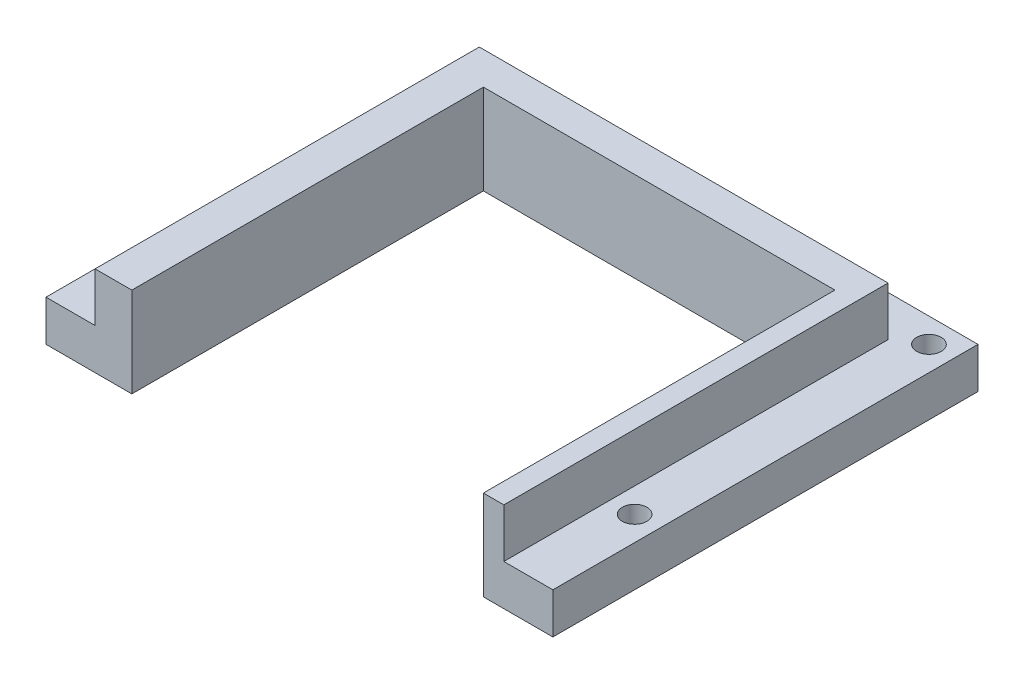
ISO-10303-21;
HEADER;
FILE_DESCRIPTION(('STEP AP214'),'2;1');
FILE_NAME('part.step','',(''),(''),'','','');
FILE_SCHEMA(('AUTOMOTIVE_DESIGN { 1 0 10303 214 1 1 1 1 }'));
ENDSEC;
DATA;
#1=APPLICATION_CONTEXT('core data for automotive mechanical design processes');
#2=APPLICATION_PROTOCOL_DEFINITION('international standard','automotive_design',2000,#1);
#3=PRODUCT_CONTEXT('',#1,'mechanical');
#4=PRODUCT('Part','Part','',(#3));
#5=PRODUCT_RELATED_PRODUCT_CATEGORY('part','',(#4));
#6=PRODUCT_DEFINITION_FORMATION('','',#4);
#7=PRODUCT_DEFINITION_CONTEXT('part definition',#1,'design');
#8=PRODUCT_DEFINITION('design','',#6,#7);
#9=PRODUCT_DEFINITION_SHAPE('','',#8);
#10=(LENGTH_UNIT() NAMED_UNIT(*) SI_UNIT(.MILLI.,.METRE.));
#11=(NAMED_UNIT(*) PLANE_ANGLE_UNIT() SI_UNIT($,.RADIAN.));
#12=(NAMED_UNIT(*) SI_UNIT($,.STERADIAN.) SOLID_ANGLE_UNIT());
#13=UNCERTAINTY_MEASURE_WITH_UNIT(LENGTH_MEASURE(1.E-05),#10,'distance_accuracy_value','');
#14=(GEOMETRIC_REPRESENTATION_CONTEXT(3) GLOBAL_UNCERTAINTY_ASSIGNED_CONTEXT((#13)) GLOBAL_UNIT_ASSIGNED_CONTEXT((#10,
#11,#12)) REPRESENTATION_CONTEXT('',''));
#15=CARTESIAN_POINT('',(0.,0.,0.));
#16=DIRECTION('',(0.,0.,1.));
#17=DIRECTION('',(1.,0.,0.));
#18=AXIS2_PLACEMENT_3D('',#15,#16,#17);
#19=CARTESIAN_POINT('',(0.,5.,0.));
#20=DIRECTION('',(0.,0.,-1.));
#21=DIRECTION('',(-1.,0.,0.));
#22=AXIS2_PLACEMENT_3D('',#19,#20,#21);
#23=PLANE('',#22);
#24=DIRECTION('',(0.,-1.,0.));
#25=VECTOR('',#24,1.);
#26=CARTESIAN_POINT('',(53.5,20.,0.));
#27=LINE('',#26,#25);
#28=CARTESIAN_POINT('',(53.5,11.,0.));
#29=VERTEX_POINT('',#28);
#30=CARTESIAN_POINT('',(53.5,0.,0.));
#31=VERTEX_POINT('',#30);
#32=EDGE_CURVE('E253',#29,#31,#27,.T.);
#33=ORIENTED_EDGE('',*,*,#32,.T.);
#34=DIRECTION('',(1.,0.,0.));
#35=VECTOR('',#34,1.);
#36=CARTESIAN_POINT('',(0.,0.,0.));
#37=LINE('',#36,#35);
#38=CARTESIAN_POINT('',(62.,0.,0.));
#39=VERTEX_POINT('',#38);
#40=EDGE_CURVE('E178',#31,#39,#37,.T.);
#41=ORIENTED_EDGE('',*,*,#40,.T.);
#42=DIRECTION('',(0.,-1.,0.));
#43=VECTOR('',#42,1.);
#44=CARTESIAN_POINT('',(62.,5.,0.));
#45=LINE('',#44,#43);
#46=CARTESIAN_POINT('',(62.,5.,0.));
#47=VERTEX_POINT('',#46);
#48=EDGE_CURVE('E192',#47,#39,#45,.T.);
#49=ORIENTED_EDGE('',*,*,#48,.F.);
#50=DIRECTION('',(1.,0.,0.));
#51=VECTOR('',#50,1.);
#52=CARTESIAN_POINT('',(0.,5.,0.));
#53=LINE('',#52,#51);
#54=CARTESIAN_POINT('',(56.,5.,0.));
#55=VERTEX_POINT('',#54);
#56=EDGE_CURVE('E90',#55,#47,#53,.T.);
#57=ORIENTED_EDGE('',*,*,#56,.F.);
#58=DIRECTION('',(0.,-1.,0.));
#59=VECTOR('',#58,1.);
#60=CARTESIAN_POINT('',(56.,11.,0.));
#61=LINE('',#60,#59);
#62=CARTESIAN_POINT('',(56.,11.,0.));
#63=VERTEX_POINT('',#62);
#64=EDGE_CURVE('E139',#63,#55,#61,.T.);
#65=ORIENTED_EDGE('',*,*,#64,.F.);
#66=DIRECTION('',(1.,0.,0.));
#67=VECTOR('',#66,1.);
#68=CARTESIAN_POINT('',(0.,11.,0.));
#69=LINE('',#68,#67);
#70=EDGE_CURVE('E221',#29,#63,#69,.T.);
#71=ORIENTED_EDGE('',*,*,#70,.F.);
#72=EDGE_LOOP('',(#33,#41,#49,#57,#65,#71));
#73=FACE_BOUND('',#72,.T.);
#74=ADVANCED_FACE('F35',(#73),#23,.F.);
#75=DIRECTION('',(0.,-1.,0.));
#76=VECTOR('',#75,1.);
#77=CARTESIAN_POINT('',(10.5,20.,0.));
#78=LINE('',#77,#76);
#79=CARTESIAN_POINT('',(10.5,11.,0.));
#80=VERTEX_POINT('',#79);
#81=CARTESIAN_POINT('',(10.5,0.,0.));
#82=VERTEX_POINT('',#81);
#83=EDGE_CURVE('E224',#80,#82,#78,.T.);
#84=ORIENTED_EDGE('',*,*,#83,.F.);
#85=CARTESIAN_POINT('',(6.,11.,0.));
#86=VERTEX_POINT('',#85);
#87=EDGE_CURVE('E127',#86,#80,#69,.T.);
#88=ORIENTED_EDGE('',*,*,#87,.F.);
#89=DIRECTION('',(0.,-1.,0.));
#90=VECTOR('',#89,1.);
#91=CARTESIAN_POINT('',(6.,11.,0.));
#92=LINE('',#91,#90);
#93=CARTESIAN_POINT('',(6.,5.,0.));
#94=VERTEX_POINT('',#93);
#95=EDGE_CURVE('E119',#86,#94,#92,.T.);
#96=ORIENTED_EDGE('',*,*,#95,.T.);
#97=CARTESIAN_POINT('',(0.,5.,0.));
#98=VERTEX_POINT('',#97);
#99=EDGE_CURVE('E105',#98,#94,#53,.T.);
#100=ORIENTED_EDGE('',*,*,#99,.F.);
#101=DIRECTION('',(0.,-1.,0.));
#102=VECTOR('',#101,1.);
#103=CARTESIAN_POINT('',(0.,5.,0.));
#104=LINE('',#103,#102);
#105=CARTESIAN_POINT('',(0.,0.,0.));
#106=VERTEX_POINT('',#105);
#107=EDGE_CURVE('E81',#98,#106,#104,.T.);
#108=ORIENTED_EDGE('',*,*,#107,.T.);
#109=EDGE_CURVE('E147',#106,#82,#37,.T.);
#110=ORIENTED_EDGE('',*,*,#109,.T.);
#111=EDGE_LOOP('',(#84,#88,#96,#100,#108,#110));
#112=FACE_BOUND('',#111,.T.);
#113=ADVANCED_FACE('F125',(#112),#23,.F.);
#114=CARTESIAN_POINT('',(0.,0.,0.));
#115=DIRECTION('',(0.,1.,0.));
#116=DIRECTION('',(0.,0.,1.));
#117=AXIS2_PLACEMENT_3D('',#114,#115,#116);
#118=PLANE('',#117);
#119=CARTESIAN_POINT('',(3.,0.,-49.));
#120=DIRECTION('',(0.,1.,0.));
#121=DIRECTION('',(0.,0.,1.));
#122=AXIS2_PLACEMENT_3D('',#119,#120,#121);
#123=CIRCLE('',#122,1.5);
#124=CARTESIAN_POINT('',(3.,0.,-47.5));
#125=VERTEX_POINT('',#124);
#126=EDGE_CURVE('E173',#125,#125,#123,.T.);
#127=ORIENTED_EDGE('',*,*,#126,.T.);
#128=EDGE_LOOP('',(#127));
#129=FACE_BOUND('',#128,.T.);
#130=CARTESIAN_POINT('',(59.,0.,-49.));
#131=DIRECTION('',(0.,1.,0.));
#132=DIRECTION('',(0.,0.,1.));
#133=AXIS2_PLACEMENT_3D('',#130,#131,#132);
#134=CIRCLE('',#133,1.5);
#135=CARTESIAN_POINT('',(59.,0.,-47.5));
#136=VERTEX_POINT('',#135);
#137=EDGE_CURVE('E170',#136,#136,#134,.T.);
#138=ORIENTED_EDGE('',*,*,#137,.T.);
#139=EDGE_LOOP('',(#138));
#140=FACE_BOUND('',#139,.T.);
#141=CARTESIAN_POINT('',(59.,0.,-13.));
#142=DIRECTION('',(0.,1.,0.));
#143=DIRECTION('',(0.,0.,1.));
#144=AXIS2_PLACEMENT_3D('',#141,#142,#143);
#145=CIRCLE('',#144,1.5);
#146=CARTESIAN_POINT('',(59.,0.,-11.5));
#147=VERTEX_POINT('',#146);
#148=EDGE_CURVE('E167',#147,#147,#145,.T.);
#149=ORIENTED_EDGE('',*,*,#148,.T.);
#150=EDGE_LOOP('',(#149));
#151=FACE_BOUND('',#150,.T.);
#152=CARTESIAN_POINT('',(3.,0.,-13.));
#153=DIRECTION('',(0.,1.,0.));
#154=DIRECTION('',(0.,0.,1.));
#155=AXIS2_PLACEMENT_3D('',#152,#153,#154);
#156=CIRCLE('',#155,1.5);
#157=CARTESIAN_POINT('',(3.,0.,-11.5));
#158=VERTEX_POINT('',#157);
#159=EDGE_CURVE('E142',#158,#158,#156,.T.);
#160=ORIENTED_EDGE('',*,*,#159,.T.);
#161=EDGE_LOOP('',(#160));
#162=FACE_BOUND('',#161,.T.);
#163=DIRECTION('',(0.,0.,-1.));
#164=VECTOR('',#163,1.);
#165=CARTESIAN_POINT('',(53.5,0.,0.));
#166=LINE('',#165,#164);
#167=CARTESIAN_POINT('',(53.5,0.,-43.));
#168=VERTEX_POINT('',#167);
#169=EDGE_CURVE('E260',#31,#168,#166,.T.);
#170=ORIENTED_EDGE('',*,*,#169,.T.);
#171=DIRECTION('',(-1.,0.,0.));
#172=VECTOR('',#171,1.);
#173=CARTESIAN_POINT('',(53.5,0.,-43.));
#174=LINE('',#173,#172);
#175=CARTESIAN_POINT('',(10.5,0.,-43.));
#176=VERTEX_POINT('',#175);
#177=EDGE_CURVE('E217',#168,#176,#174,.T.);
#178=ORIENTED_EDGE('',*,*,#177,.T.);
#179=DIRECTION('',(0.,0.,1.));
#180=VECTOR('',#179,1.);
#181=CARTESIAN_POINT('',(10.5,0.,0.));
#182=LINE('',#181,#180);
#183=EDGE_CURVE('E252',#176,#82,#182,.T.);
#184=ORIENTED_EDGE('',*,*,#183,.T.);
#185=ORIENTED_EDGE('',*,*,#109,.F.);
#186=DIRECTION('',(0.,0.,-1.));
#187=VECTOR('',#186,1.);
#188=CARTESIAN_POINT('',(0.,0.,0.));
#189=LINE('',#188,#187);
#190=CARTESIAN_POINT('',(0.,0.,-52.));
#191=VERTEX_POINT('',#190);
#192=EDGE_CURVE('E184',#106,#191,#189,.T.);
#193=ORIENTED_EDGE('',*,*,#192,.T.);
#194=DIRECTION('',(1.,0.,0.));
#195=VECTOR('',#194,1.);
#196=CARTESIAN_POINT('',(0.,0.,-52.));
#197=LINE('',#196,#195);
#198=CARTESIAN_POINT('',(62.,0.,-52.));
#199=VERTEX_POINT('',#198);
#200=EDGE_CURVE('E181',#191,#199,#197,.T.);
#201=ORIENTED_EDGE('',*,*,#200,.T.);
#202=DIRECTION('',(0.,0.,-1.));
#203=VECTOR('',#202,1.);
#204=CARTESIAN_POINT('',(62.,0.,0.));
#205=LINE('',#204,#203);
#206=EDGE_CURVE('E176',#39,#199,#205,.T.);
#207=ORIENTED_EDGE('',*,*,#206,.F.);
#208=ORIENTED_EDGE('',*,*,#40,.F.);
#209=EDGE_LOOP('',(#170,#178,#184,#185,#193,#201,#207,#208));
#210=FACE_BOUND('',#209,.T.);
#211=ADVANCED_FACE('F255',(#129,#140,#151,#162,#210),#118,.F.);
#212=CARTESIAN_POINT('',(0.,11.,0.));
#213=DIRECTION('',(0.,1.,0.));
#214=DIRECTION('',(0.,0.,1.));
#215=AXIS2_PLACEMENT_3D('',#212,#213,#214);
#216=PLANE('',#215);
#217=DIRECTION('',(1.,0.,0.));
#218=VECTOR('',#217,1.);
#219=CARTESIAN_POINT('',(0.,11.,-43.));
#220=LINE('',#219,#218);
#221=CARTESIAN_POINT('',(10.5,11.,-43.));
#222=VERTEX_POINT('',#221);
#223=CARTESIAN_POINT('',(53.5,11.,-43.));
#224=VERTEX_POINT('',#223);
#225=EDGE_CURVE('E43',#222,#224,#220,.T.);
#226=ORIENTED_EDGE('',*,*,#225,.T.);
#227=DIRECTION('',(0.,0.,1.));
#228=VECTOR('',#227,1.);
#229=CARTESIAN_POINT('',(53.5,11.,0.));
#230=LINE('',#229,#228);
#231=EDGE_CURVE('E11',#224,#29,#230,.T.);
#232=ORIENTED_EDGE('',*,*,#231,.T.);
#233=ORIENTED_EDGE('',*,*,#70,.T.);
#234=DIRECTION('',(0.,0.,-1.));
#235=VECTOR('',#234,1.);
#236=CARTESIAN_POINT('',(56.,11.,0.));
#237=LINE('',#236,#235);
#238=CARTESIAN_POINT('',(56.,11.,-47.));
#239=VERTEX_POINT('',#238);
#240=EDGE_CURVE('E228',#63,#239,#237,.T.);
#241=ORIENTED_EDGE('',*,*,#240,.T.);
#242=DIRECTION('',(1.,0.,0.));
#243=VECTOR('',#242,1.);
#244=CARTESIAN_POINT('',(0.,11.,-47.));
#245=LINE('',#244,#243);
#246=CARTESIAN_POINT('',(6.,11.,-47.));
#247=VERTEX_POINT('',#246);
#248=EDGE_CURVE('E133',#247,#239,#245,.T.);
#249=ORIENTED_EDGE('',*,*,#248,.F.);
#250=DIRECTION('',(0.,0.,-1.));
#251=VECTOR('',#250,1.);
#252=CARTESIAN_POINT('',(6.,11.,0.));
#253=LINE('',#252,#251);
#254=EDGE_CURVE('E129',#86,#247,#253,.T.);
#255=ORIENTED_EDGE('',*,*,#254,.F.);
#256=ORIENTED_EDGE('',*,*,#87,.T.);
#257=DIRECTION('',(0.,0.,-1.));
#258=VECTOR('',#257,1.);
#259=CARTESIAN_POINT('',(10.5,11.,0.));
#260=LINE('',#259,#258);
#261=EDGE_CURVE('E195',#80,#222,#260,.T.);
#262=ORIENTED_EDGE('',*,*,#261,.T.);
#263=EDGE_LOOP('',(#226,#232,#233,#241,#249,#255,#256,#262));
#264=FACE_BOUND('',#263,.T.);
#265=ADVANCED_FACE('F200',(#264),#216,.T.);
#266=CARTESIAN_POINT('',(62.,5.,0.));
#267=DIRECTION('',(-1.,0.,0.));
#268=DIRECTION('',(0.,0.,1.));
#269=AXIS2_PLACEMENT_3D('',#266,#267,#268);
#270=PLANE('',#269);
#271=ORIENTED_EDGE('',*,*,#206,.T.);
#272=DIRECTION('',(0.,-1.,0.));
#273=VECTOR('',#272,1.);
#274=CARTESIAN_POINT('',(62.,5.,-52.));
#275=LINE('',#274,#273);
#276=CARTESIAN_POINT('',(62.,5.,-52.));
#277=VERTEX_POINT('',#276);
#278=EDGE_CURVE('E190',#277,#199,#275,.T.);
#279=ORIENTED_EDGE('',*,*,#278,.F.);
#280=DIRECTION('',(0.,0.,-1.));
#281=VECTOR('',#280,1.);
#282=CARTESIAN_POINT('',(62.,5.,0.));
#283=LINE('',#282,#281);
#284=EDGE_CURVE('E158',#47,#277,#283,.T.);
#285=ORIENTED_EDGE('',*,*,#284,.F.);
#286=ORIENTED_EDGE('',*,*,#48,.T.);
#287=EDGE_LOOP('',(#271,#279,#285,#286));
#288=FACE_BOUND('',#287,.T.);
#289=ADVANCED_FACE('F270',(#288),#270,.F.);
#290=CARTESIAN_POINT('',(0.,5.,-52.));
#291=DIRECTION('',(0.,0.,-1.));
#292=DIRECTION('',(-1.,0.,0.));
#293=AXIS2_PLACEMENT_3D('',#290,#291,#292);
#294=PLANE('',#293);
#295=ORIENTED_EDGE('',*,*,#200,.F.);
#296=DIRECTION('',(0.,-1.,0.));
#297=VECTOR('',#296,1.);
#298=CARTESIAN_POINT('',(0.,5.,-52.));
#299=LINE('',#298,#297);
#300=CARTESIAN_POINT('',(0.,5.,-52.));
#301=VERTEX_POINT('',#300);
#302=EDGE_CURVE('E188',#301,#191,#299,.T.);
#303=ORIENTED_EDGE('',*,*,#302,.F.);
#304=DIRECTION('',(1.,0.,0.));
#305=VECTOR('',#304,1.);
#306=CARTESIAN_POINT('',(0.,5.,-52.));
#307=LINE('',#306,#305);
#308=EDGE_CURVE('E160',#301,#277,#307,.T.);
#309=ORIENTED_EDGE('',*,*,#308,.T.);
#310=ORIENTED_EDGE('',*,*,#278,.T.);
#311=EDGE_LOOP('',(#295,#303,#309,#310));
#312=FACE_BOUND('',#311,.T.);
#313=ADVANCED_FACE('F273',(#312),#294,.T.);
#314=CARTESIAN_POINT('',(0.,5.,0.));
#315=DIRECTION('',(-1.,0.,0.));
#316=DIRECTION('',(0.,0.,1.));
#317=AXIS2_PLACEMENT_3D('',#314,#315,#316);
#318=PLANE('',#317);
#319=ORIENTED_EDGE('',*,*,#192,.F.);
#320=ORIENTED_EDGE('',*,*,#107,.F.);
#321=DIRECTION('',(0.,0.,-1.));
#322=VECTOR('',#321,1.);
#323=CARTESIAN_POINT('',(0.,5.,0.));
#324=LINE('',#323,#322);
#325=EDGE_CURVE('E111',#98,#301,#324,.T.);
#326=ORIENTED_EDGE('',*,*,#325,.T.);
#327=ORIENTED_EDGE('',*,*,#302,.T.);
#328=EDGE_LOOP('',(#319,#320,#326,#327));
#329=FACE_BOUND('',#328,.T.);
#330=ADVANCED_FACE('F275',(#329),#318,.T.);
#331=CARTESIAN_POINT('',(3.,5.,-49.));
#332=DIRECTION('',(0.,-1.,0.));
#333=DIRECTION('',(0.,0.,-1.));
#334=AXIS2_PLACEMENT_3D('',#331,#332,#333);
#335=CYLINDRICAL_SURFACE('',#334,1.5);
#336=CARTESIAN_POINT('',(3.,5.,-49.));
#337=DIRECTION('',(0.,1.,0.));
#338=DIRECTION('',(0.,0.,1.));
#339=AXIS2_PLACEMENT_3D('',#336,#337,#338);
#340=CIRCLE('',#339,1.5);
#341=CARTESIAN_POINT('',(3.,5.,-47.5));
#342=VERTEX_POINT('',#341);
#343=EDGE_CURVE('E153',#342,#342,#340,.T.);
#344=ORIENTED_EDGE('',*,*,#343,.T.);
#345=EDGE_LOOP('',(#344));
#346=FACE_BOUND('',#345,.T.);
#347=ORIENTED_EDGE('',*,*,#126,.F.);
#348=EDGE_LOOP('',(#347));
#349=FACE_BOUND('',#348,.T.);
#350=ADVANCED_FACE('F277',(#346,#349),#335,.F.);
#351=CARTESIAN_POINT('',(59.,5.,-49.));
#352=DIRECTION('',(0.,-1.,0.));
#353=DIRECTION('',(0.,0.,-1.));
#354=AXIS2_PLACEMENT_3D('',#351,#352,#353);
#355=CYLINDRICAL_SURFACE('',#354,1.5);
#356=CARTESIAN_POINT('',(59.,5.,-49.));
#357=DIRECTION('',(0.,1.,0.));
#358=DIRECTION('',(0.,0.,1.));
#359=AXIS2_PLACEMENT_3D('',#356,#357,#358);
#360=CIRCLE('',#359,1.5);
#361=CARTESIAN_POINT('',(59.,5.,-47.5));
#362=VERTEX_POINT('',#361);
#363=EDGE_CURVE('E150',#362,#362,#360,.T.);
#364=ORIENTED_EDGE('',*,*,#363,.T.);
#365=EDGE_LOOP('',(#364));
#366=FACE_BOUND('',#365,.T.);
#367=ORIENTED_EDGE('',*,*,#137,.F.);
#368=EDGE_LOOP('',(#367));
#369=FACE_BOUND('',#368,.T.);
#370=ADVANCED_FACE('F283',(#366,#369),#355,.F.);
#371=CARTESIAN_POINT('',(59.,5.,-13.));
#372=DIRECTION('',(0.,-1.,0.));
#373=DIRECTION('',(0.,0.,-1.));
#374=AXIS2_PLACEMENT_3D('',#371,#372,#373);
#375=CYLINDRICAL_SURFACE('',#374,1.5);
#376=CARTESIAN_POINT('',(59.,5.,-13.));
#377=DIRECTION('',(0.,1.,0.));
#378=DIRECTION('',(0.,0.,1.));
#379=AXIS2_PLACEMENT_3D('',#376,#377,#378);
#380=CIRCLE('',#379,1.5);
#381=CARTESIAN_POINT('',(59.,5.,-11.5));
#382=VERTEX_POINT('',#381);
#383=EDGE_CURVE('E146',#382,#382,#380,.T.);
#384=ORIENTED_EDGE('',*,*,#383,.T.);
#385=EDGE_LOOP('',(#384));
#386=FACE_BOUND('',#385,.T.);
#387=ORIENTED_EDGE('',*,*,#148,.F.);
#388=EDGE_LOOP('',(#387));
#389=FACE_BOUND('',#388,.T.);
#390=ADVANCED_FACE('F345',(#386,#389),#375,.F.);
#391=CARTESIAN_POINT('',(3.,5.,-13.));
#392=DIRECTION('',(0.,-1.,0.));
#393=DIRECTION('',(0.,0.,-1.));
#394=AXIS2_PLACEMENT_3D('',#391,#392,#393);
#395=CYLINDRICAL_SURFACE('',#394,1.5);
#396=CARTESIAN_POINT('',(3.,5.,-13.));
#397=DIRECTION('',(0.,1.,0.));
#398=DIRECTION('',(0.,0.,1.));
#399=AXIS2_PLACEMENT_3D('',#396,#397,#398);
#400=CIRCLE('',#399,1.5);
#401=CARTESIAN_POINT('',(3.,5.,-11.5));
#402=VERTEX_POINT('',#401);
#403=EDGE_CURVE('E143',#402,#402,#400,.T.);
#404=ORIENTED_EDGE('',*,*,#403,.T.);
#405=EDGE_LOOP('',(#404));
#406=FACE_BOUND('',#405,.T.);
#407=ORIENTED_EDGE('',*,*,#159,.F.);
#408=EDGE_LOOP('',(#407));
#409=FACE_BOUND('',#408,.T.);
#410=ADVANCED_FACE('F37',(#406,#409),#395,.F.);
#411=CARTESIAN_POINT('',(0.,5.,0.));
#412=DIRECTION('',(0.,1.,0.));
#413=DIRECTION('',(0.,0.,1.));
#414=AXIS2_PLACEMENT_3D('',#411,#412,#413);
#415=PLANE('',#414);
#416=ORIENTED_EDGE('',*,*,#403,.F.);
#417=EDGE_LOOP('',(#416));
#418=FACE_BOUND('',#417,.T.);
#419=ORIENTED_EDGE('',*,*,#383,.F.);
#420=EDGE_LOOP('',(#419));
#421=FACE_BOUND('',#420,.T.);
#422=ORIENTED_EDGE('',*,*,#363,.F.);
#423=EDGE_LOOP('',(#422));
#424=FACE_BOUND('',#423,.T.);
#425=ORIENTED_EDGE('',*,*,#343,.F.);
#426=EDGE_LOOP('',(#425));
#427=FACE_BOUND('',#426,.T.);
#428=DIRECTION('',(0.,0.,-1.));
#429=VECTOR('',#428,1.);
#430=CARTESIAN_POINT('',(56.,5.,0.));
#431=LINE('',#430,#429);
#432=CARTESIAN_POINT('',(56.,5.,-47.));
#433=VERTEX_POINT('',#432);
#434=EDGE_CURVE('E156',#55,#433,#431,.T.);
#435=ORIENTED_EDGE('',*,*,#434,.F.);
#436=ORIENTED_EDGE('',*,*,#56,.T.);
#437=ORIENTED_EDGE('',*,*,#284,.T.);
#438=ORIENTED_EDGE('',*,*,#308,.F.);
#439=ORIENTED_EDGE('',*,*,#325,.F.);
#440=ORIENTED_EDGE('',*,*,#99,.T.);
#441=DIRECTION('',(0.,0.,-1.));
#442=VECTOR('',#441,1.);
#443=CARTESIAN_POINT('',(6.,5.,0.));
#444=LINE('',#443,#442);
#445=CARTESIAN_POINT('',(6.,5.,-47.));
#446=VERTEX_POINT('',#445);
#447=EDGE_CURVE('E108',#94,#446,#444,.T.);
#448=ORIENTED_EDGE('',*,*,#447,.T.);
#449=DIRECTION('',(1.,0.,0.));
#450=VECTOR('',#449,1.);
#451=CARTESIAN_POINT('',(0.,5.,-47.));
#452=LINE('',#451,#450);
#453=EDGE_CURVE('E59',#446,#433,#452,.T.);
#454=ORIENTED_EDGE('',*,*,#453,.T.);
#455=EDGE_LOOP('',(#435,#436,#437,#438,#439,#440,#448,#454));
#456=FACE_BOUND('',#455,.T.);
#457=ADVANCED_FACE('F107',(#418,#421,#424,#427,#456),#415,.T.);
#458=CARTESIAN_POINT('',(56.,11.,0.));
#459=DIRECTION('',(-1.,0.,0.));
#460=DIRECTION('',(0.,0.,1.));
#461=AXIS2_PLACEMENT_3D('',#458,#459,#460);
#462=PLANE('',#461);
#463=ORIENTED_EDGE('',*,*,#434,.T.);
#464=DIRECTION('',(0.,-1.,0.));
#465=VECTOR('',#464,1.);
#466=CARTESIAN_POINT('',(56.,11.,-47.));
#467=LINE('',#466,#465);
#468=EDGE_CURVE('E131',#239,#433,#467,.T.);
#469=ORIENTED_EDGE('',*,*,#468,.F.);
#470=ORIENTED_EDGE('',*,*,#240,.F.);
#471=ORIENTED_EDGE('',*,*,#64,.T.);
#472=EDGE_LOOP('',(#463,#469,#470,#471));
#473=FACE_BOUND('',#472,.T.);
#474=ADVANCED_FACE('F267',(#473),#462,.F.);
#475=CARTESIAN_POINT('',(0.,11.,-47.));
#476=DIRECTION('',(0.,0.,-1.));
#477=DIRECTION('',(-1.,0.,0.));
#478=AXIS2_PLACEMENT_3D('',#475,#476,#477);
#479=PLANE('',#478);
#480=ORIENTED_EDGE('',*,*,#468,.T.);
#481=ORIENTED_EDGE('',*,*,#453,.F.);
#482=DIRECTION('',(0.,-1.,0.));
#483=VECTOR('',#482,1.);
#484=CARTESIAN_POINT('',(6.,11.,-47.));
#485=LINE('',#484,#483);
#486=EDGE_CURVE('E122',#247,#446,#485,.T.);
#487=ORIENTED_EDGE('',*,*,#486,.F.);
#488=ORIENTED_EDGE('',*,*,#248,.T.);
#489=EDGE_LOOP('',(#480,#481,#487,#488));
#490=FACE_BOUND('',#489,.T.);
#491=ADVANCED_FACE('F234',(#490),#479,.T.);
#492=CARTESIAN_POINT('',(6.,11.,0.));
#493=DIRECTION('',(-1.,0.,0.));
#494=DIRECTION('',(0.,0.,1.));
#495=AXIS2_PLACEMENT_3D('',#492,#493,#494);
#496=PLANE('',#495);
#497=ORIENTED_EDGE('',*,*,#486,.T.);
#498=ORIENTED_EDGE('',*,*,#447,.F.);
#499=ORIENTED_EDGE('',*,*,#95,.F.);
#500=ORIENTED_EDGE('',*,*,#254,.T.);
#501=EDGE_LOOP('',(#497,#498,#499,#500));
#502=FACE_BOUND('',#501,.T.);
#503=ADVANCED_FACE('F117',(#502),#496,.T.);
#504=CARTESIAN_POINT('',(53.5,20.,0.));
#505=DIRECTION('',(-1.,0.,0.));
#506=DIRECTION('',(0.,0.,1.));
#507=AXIS2_PLACEMENT_3D('',#504,#505,#506);
#508=PLANE('',#507);
#509=DIRECTION('',(0.,-1.,0.));
#510=VECTOR('',#509,1.);
#511=CARTESIAN_POINT('',(53.5,20.,-43.));
#512=LINE('',#511,#510);
#513=EDGE_CURVE('E214',#224,#168,#512,.T.);
#514=ORIENTED_EDGE('',*,*,#513,.T.);
#515=ORIENTED_EDGE('',*,*,#169,.F.);
#516=ORIENTED_EDGE('',*,*,#32,.F.);
#517=ORIENTED_EDGE('',*,*,#231,.F.);
#518=EDGE_LOOP('',(#514,#515,#516,#517));
#519=FACE_BOUND('',#518,.T.);
#520=ADVANCED_FACE('F265',(#519),#508,.T.);
#521=CARTESIAN_POINT('',(53.5,20.,-43.));
#522=DIRECTION('',(0.,0.,1.));
#523=DIRECTION('',(1.,0.,0.));
#524=AXIS2_PLACEMENT_3D('',#521,#522,#523);
#525=PLANE('',#524);
#526=DIRECTION('',(0.,-1.,0.));
#527=VECTOR('',#526,1.);
#528=CARTESIAN_POINT('',(10.5,20.,-43.));
#529=LINE('',#528,#527);
#530=EDGE_CURVE('E50',#222,#176,#529,.T.);
#531=ORIENTED_EDGE('',*,*,#530,.T.);
#532=ORIENTED_EDGE('',*,*,#177,.F.);
#533=ORIENTED_EDGE('',*,*,#513,.F.);
#534=ORIENTED_EDGE('',*,*,#225,.F.);
#535=EDGE_LOOP('',(#531,#532,#533,#534));
#536=FACE_BOUND('',#535,.T.);
#537=ADVANCED_FACE('F210',(#536),#525,.T.);
#538=CARTESIAN_POINT('',(10.5,20.,0.));
#539=DIRECTION('',(1.,0.,0.));
#540=DIRECTION('',(0.,0.,-1.));
#541=AXIS2_PLACEMENT_3D('',#538,#539,#540);
#542=PLANE('',#541);
#543=ORIENTED_EDGE('',*,*,#83,.T.);
#544=ORIENTED_EDGE('',*,*,#183,.F.);
#545=ORIENTED_EDGE('',*,*,#530,.F.);
#546=ORIENTED_EDGE('',*,*,#261,.F.);
#547=EDGE_LOOP('',(#543,#544,#545,#546));
#548=FACE_BOUND('',#547,.T.);
#549=ADVANCED_FACE('F251',(#548),#542,.T.);
#550=CLOSED_SHELL('',(#74,#113,#211,#265,#289,#313,#330,#350,#370,#390,#410,#457,#474,#491,#503,
#520,#537,#549));
#551=MANIFOLD_SOLID_BREP('B2',#550);
#552=ADVANCED_BREP_SHAPE_REPRESENTATION('',(#18,#551),#14);
#553=SHAPE_DEFINITION_REPRESENTATION(#9,#552);
ENDSEC;
END-ISO-10303-21;
